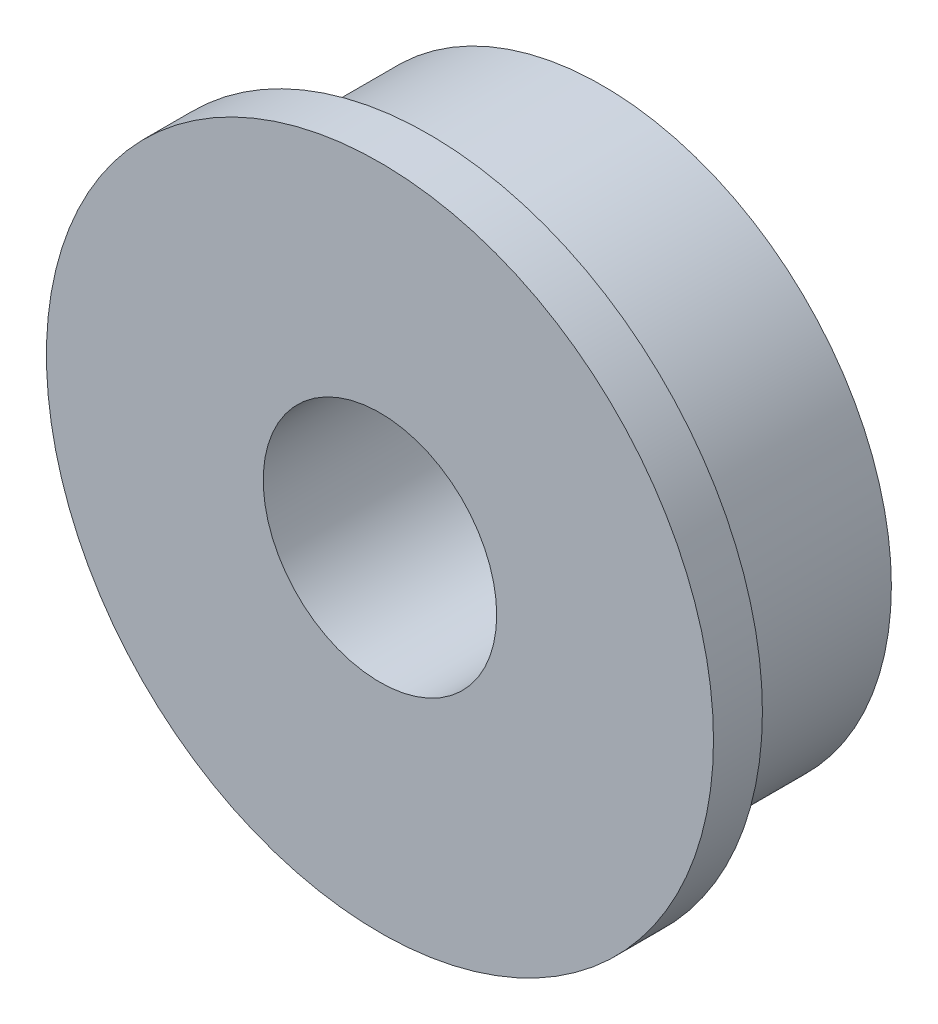
ISO-10303-21;
HEADER;
FILE_DESCRIPTION(('STEP AP214'),'2;1');
FILE_NAME('part.step','',(''),(''),'','','');
FILE_SCHEMA(('AUTOMOTIVE_DESIGN { 1 0 10303 214 1 1 1 1 }'));
ENDSEC;
DATA;
#1=APPLICATION_CONTEXT('core data for automotive mechanical design processes');
#2=APPLICATION_PROTOCOL_DEFINITION('international standard','automotive_design',2000,#1);
#3=PRODUCT_CONTEXT('',#1,'mechanical');
#4=PRODUCT('Part','Part','',(#3));
#5=PRODUCT_RELATED_PRODUCT_CATEGORY('part','',(#4));
#6=PRODUCT_DEFINITION_FORMATION('','',#4);
#7=PRODUCT_DEFINITION_CONTEXT('part definition',#1,'design');
#8=PRODUCT_DEFINITION('design','',#6,#7);
#9=PRODUCT_DEFINITION_SHAPE('','',#8);
#10=(LENGTH_UNIT() NAMED_UNIT(*) SI_UNIT(.MILLI.,.METRE.));
#11=(NAMED_UNIT(*) PLANE_ANGLE_UNIT() SI_UNIT($,.RADIAN.));
#12=(NAMED_UNIT(*) SI_UNIT($,.STERADIAN.) SOLID_ANGLE_UNIT());
#13=UNCERTAINTY_MEASURE_WITH_UNIT(LENGTH_MEASURE(1.E-05),#10,'distance_accuracy_value','');
#14=(GEOMETRIC_REPRESENTATION_CONTEXT(3) GLOBAL_UNCERTAINTY_ASSIGNED_CONTEXT((#13)) GLOBAL_UNIT_ASSIGNED_CONTEXT((#10,
#11,#12)) REPRESENTATION_CONTEXT('',''));
#15=CARTESIAN_POINT('',(0.,0.,0.));
#16=DIRECTION('',(0.,0.,1.));
#17=DIRECTION('',(1.,0.,0.));
#18=AXIS2_PLACEMENT_3D('',#15,#16,#17);
#19=CARTESIAN_POINT('',(0.,0.,0.));
#20=DIRECTION('',(0.,0.,1.));
#21=DIRECTION('',(1.,0.,0.));
#22=AXIS2_PLACEMENT_3D('',#19,#20,#21);
#23=PLANE('',#22);
#24=CARTESIAN_POINT('',(0.,0.,0.));
#25=DIRECTION('',(0.,0.,1.));
#26=DIRECTION('',(1.,0.,0.));
#27=AXIS2_PLACEMENT_3D('',#24,#25,#26);
#28=CIRCLE('',#27,6.5);
#29=CARTESIAN_POINT('',(6.5,0.,0.));
#30=VERTEX_POINT('',#29);
#31=EDGE_CURVE('E38',#30,#30,#28,.T.);
#32=ORIENTED_EDGE('',*,*,#31,.F.);
#33=EDGE_LOOP('',(#32));
#34=FACE_BOUND('',#33,.T.);
#35=CARTESIAN_POINT('',(0.,0.,0.));
#36=DIRECTION('',(0.,0.,1.));
#37=DIRECTION('',(1.,0.,0.));
#38=AXIS2_PLACEMENT_3D('',#35,#36,#37);
#39=CIRCLE('',#38,2.625);
#40=CARTESIAN_POINT('',(2.625,0.,0.));
#41=VERTEX_POINT('',#40);
#42=EDGE_CURVE('E45',#41,#41,#39,.T.);
#43=ORIENTED_EDGE('',*,*,#42,.T.);
#44=EDGE_LOOP('',(#43));
#45=FACE_BOUND('',#44,.T.);
#46=ADVANCED_FACE('F34',(#34,#45),#23,.F.);
#47=CARTESIAN_POINT('',(0.,0.,3.9));
#48=DIRECTION('',(0.,0.,-1.));
#49=DIRECTION('',(-1.,0.,0.));
#50=AXIS2_PLACEMENT_3D('',#47,#48,#49);
#51=CYLINDRICAL_SURFACE('',#50,6.5);
#52=CARTESIAN_POINT('',(0.,0.,3.9));
#53=DIRECTION('',(0.,0.,1.));
#54=DIRECTION('',(1.,0.,0.));
#55=AXIS2_PLACEMENT_3D('',#52,#53,#54);
#56=CIRCLE('',#55,6.5);
#57=CARTESIAN_POINT('',(6.5,0.,3.9));
#58=VERTEX_POINT('',#57);
#59=EDGE_CURVE('E10',#58,#58,#56,.T.);
#60=ORIENTED_EDGE('',*,*,#59,.F.);
#61=EDGE_LOOP('',(#60));
#62=FACE_BOUND('',#61,.T.);
#63=ORIENTED_EDGE('',*,*,#31,.T.);
#64=EDGE_LOOP('',(#63));
#65=FACE_BOUND('',#64,.T.);
#66=ADVANCED_FACE('F36',(#62,#65),#51,.T.);
#67=CARTESIAN_POINT('',(0.,0.,3.9));
#68=DIRECTION('',(0.,0.,-1.));
#69=DIRECTION('',(-1.,0.,0.));
#70=AXIS2_PLACEMENT_3D('',#67,#68,#69);
#71=CYLINDRICAL_SURFACE('',#70,2.625);
#72=ORIENTED_EDGE('',*,*,#42,.F.);
#73=EDGE_LOOP('',(#72));
#74=FACE_BOUND('',#73,.T.);
#75=CARTESIAN_POINT('',(0.,0.,5.));
#76=DIRECTION('',(0.,0.,1.));
#77=DIRECTION('',(1.,0.,0.));
#78=AXIS2_PLACEMENT_3D('',#75,#76,#77);
#79=CIRCLE('',#78,2.625);
#80=CARTESIAN_POINT('',(2.625,0.,5.));
#81=VERTEX_POINT('',#80);
#82=EDGE_CURVE('E53',#81,#81,#79,.T.);
#83=ORIENTED_EDGE('',*,*,#82,.T.);
#84=EDGE_LOOP('',(#83));
#85=FACE_BOUND('',#84,.T.);
#86=ADVANCED_FACE('F59',(#74,#85),#71,.F.);
#87=CARTESIAN_POINT('',(0.,0.,3.9));
#88=DIRECTION('',(0.,0.,1.));
#89=DIRECTION('',(1.,0.,0.));
#90=AXIS2_PLACEMENT_3D('',#87,#88,#89);
#91=PLANE('',#90);
#92=CARTESIAN_POINT('',(0.,0.,3.9));
#93=DIRECTION('',(0.,0.,1.));
#94=DIRECTION('',(1.,0.,0.));
#95=AXIS2_PLACEMENT_3D('',#92,#93,#94);
#96=CIRCLE('',#95,7.5);
#97=CARTESIAN_POINT('',(7.5,0.,3.9));
#98=VERTEX_POINT('',#97);
#99=EDGE_CURVE('E50',#98,#98,#96,.T.);
#100=ORIENTED_EDGE('',*,*,#99,.F.);
#101=EDGE_LOOP('',(#100));
#102=FACE_BOUND('',#101,.T.);
#103=ORIENTED_EDGE('',*,*,#59,.T.);
#104=EDGE_LOOP('',(#103));
#105=FACE_BOUND('',#104,.T.);
#106=ADVANCED_FACE('F64',(#102,#105),#91,.F.);
#107=CARTESIAN_POINT('',(0.,0.,5.));
#108=DIRECTION('',(0.,0.,1.));
#109=DIRECTION('',(1.,0.,0.));
#110=AXIS2_PLACEMENT_3D('',#107,#108,#109);
#111=PLANE('',#110);
#112=CARTESIAN_POINT('',(0.,0.,5.));
#113=DIRECTION('',(0.,0.,1.));
#114=DIRECTION('',(1.,0.,0.));
#115=AXIS2_PLACEMENT_3D('',#112,#113,#114);
#116=CIRCLE('',#115,7.5);
#117=CARTESIAN_POINT('',(7.5,0.,5.));
#118=VERTEX_POINT('',#117);
#119=EDGE_CURVE('E49',#118,#118,#116,.T.);
#120=ORIENTED_EDGE('',*,*,#119,.T.);
#121=EDGE_LOOP('',(#120));
#122=FACE_BOUND('',#121,.T.);
#123=ORIENTED_EDGE('',*,*,#82,.F.);
#124=EDGE_LOOP('',(#123));
#125=FACE_BOUND('',#124,.T.);
#126=ADVANCED_FACE('F61',(#122,#125),#111,.T.);
#127=CARTESIAN_POINT('',(0.,0.,5.));
#128=DIRECTION('',(0.,0.,-1.));
#129=DIRECTION('',(-1.,0.,0.));
#130=AXIS2_PLACEMENT_3D('',#127,#128,#129);
#131=CYLINDRICAL_SURFACE('',#130,7.5);
#132=ORIENTED_EDGE('',*,*,#119,.F.);
#133=EDGE_LOOP('',(#132));
#134=FACE_BOUND('',#133,.T.);
#135=ORIENTED_EDGE('',*,*,#99,.T.);
#136=EDGE_LOOP('',(#135));
#137=FACE_BOUND('',#136,.T.);
#138=ADVANCED_FACE('F63',(#134,#137),#131,.T.);
#139=CLOSED_SHELL('',(#46,#66,#86,#106,#126,#138));
#140=MANIFOLD_SOLID_BREP('B2',#139);
#141=ADVANCED_BREP_SHAPE_REPRESENTATION('',(#18,#140),#14);
#142=SHAPE_DEFINITION_REPRESENTATION(#9,#141);
ENDSEC;
END-ISO-10303-21;
